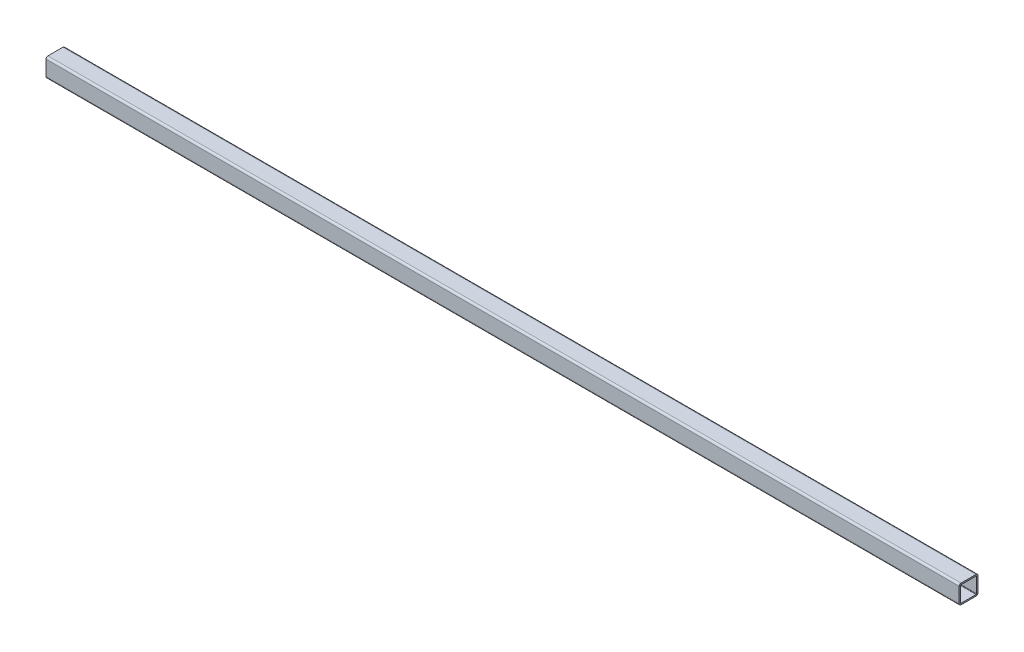
ISO-10303-21;
HEADER;
FILE_DESCRIPTION(('STEP AP214'),'2;1');
FILE_NAME('part.step','',(''),(''),'','','');
FILE_SCHEMA(('AUTOMOTIVE_DESIGN { 1 0 10303 214 1 1 1 1 }'));
ENDSEC;
DATA;
#1=APPLICATION_CONTEXT('core data for automotive mechanical design processes');
#2=APPLICATION_PROTOCOL_DEFINITION('international standard','automotive_design',2000,#1);
#3=PRODUCT_CONTEXT('',#1,'mechanical');
#4=PRODUCT('Part','Part','',(#3));
#5=PRODUCT_RELATED_PRODUCT_CATEGORY('part','',(#4));
#6=PRODUCT_DEFINITION_FORMATION('','',#4);
#7=PRODUCT_DEFINITION_CONTEXT('part definition',#1,'design');
#8=PRODUCT_DEFINITION('design','',#6,#7);
#9=PRODUCT_DEFINITION_SHAPE('','',#8);
#10=(LENGTH_UNIT() NAMED_UNIT(*) SI_UNIT(.MILLI.,.METRE.));
#11=(NAMED_UNIT(*) PLANE_ANGLE_UNIT() SI_UNIT($,.RADIAN.));
#12=(NAMED_UNIT(*) SI_UNIT($,.STERADIAN.) SOLID_ANGLE_UNIT());
#13=UNCERTAINTY_MEASURE_WITH_UNIT(LENGTH_MEASURE(1.E-05),#10,'distance_accuracy_value','');
#14=(GEOMETRIC_REPRESENTATION_CONTEXT(3) GLOBAL_UNCERTAINTY_ASSIGNED_CONTEXT((#13)) GLOBAL_UNIT_ASSIGNED_CONTEXT((#10,
#11,#12)) REPRESENTATION_CONTEXT('',''));
#15=CARTESIAN_POINT('',(0.,0.,0.));
#16=DIRECTION('',(0.,0.,1.));
#17=DIRECTION('',(1.,0.,0.));
#18=AXIS2_PLACEMENT_3D('',#15,#16,#17);
#19=CARTESIAN_POINT('',(484.5,8.,8.));
#20=DIRECTION('',(-1.,0.,0.));
#21=DIRECTION('',(0.,0.,1.));
#22=AXIS2_PLACEMENT_3D('',#19,#20,#21);
#23=CYLINDRICAL_SURFACE('',#22,2.);
#24=CARTESIAN_POINT('',(-484.5,8.,8.));
#25=DIRECTION('',(1.,0.,0.));
#26=DIRECTION('',(0.,0.,-1.));
#27=AXIS2_PLACEMENT_3D('',#24,#25,#26);
#28=CIRCLE('',#27,2.);
#29=CARTESIAN_POINT('',(-484.5,10.,8.));
#30=VERTEX_POINT('',#29);
#31=CARTESIAN_POINT('',(-484.5,8.,9.99999999999999));
#32=VERTEX_POINT('',#31);
#33=EDGE_CURVE('E235',#30,#32,#28,.T.);
#34=ORIENTED_EDGE('',*,*,#33,.T.);
#35=DIRECTION('',(-1.,0.,0.));
#36=VECTOR('',#35,1.);
#37=CARTESIAN_POINT('',(484.5,8.,9.99999999999999));
#38=LINE('',#37,#36);
#39=CARTESIAN_POINT('',(484.5,8.,9.99999999999999));
#40=VERTEX_POINT('',#39);
#41=EDGE_CURVE('E12',#40,#32,#38,.T.);
#42=ORIENTED_EDGE('',*,*,#41,.F.);
#43=CARTESIAN_POINT('',(484.5,8.,8.));
#44=DIRECTION('',(1.,0.,0.));
#45=DIRECTION('',(0.,0.,-1.));
#46=AXIS2_PLACEMENT_3D('',#43,#44,#45);
#47=CIRCLE('',#46,2.);
#48=CARTESIAN_POINT('',(484.5,10.,8.));
#49=VERTEX_POINT('',#48);
#50=EDGE_CURVE('E313',#49,#40,#47,.T.);
#51=ORIENTED_EDGE('',*,*,#50,.F.);
#52=DIRECTION('',(-1.,0.,0.));
#53=VECTOR('',#52,1.);
#54=CARTESIAN_POINT('',(484.5,10.,8.));
#55=LINE('',#54,#53);
#56=EDGE_CURVE('E250',#49,#30,#55,.T.);
#57=ORIENTED_EDGE('',*,*,#56,.T.);
#58=EDGE_LOOP('',(#34,#42,#51,#57));
#59=FACE_BOUND('',#58,.T.);
#60=ADVANCED_FACE('F63',(#59),#23,.T.);
#61=CARTESIAN_POINT('',(484.5,8.,9.99999999999999));
#62=DIRECTION('',(0.,0.,-1.));
#63=DIRECTION('',(-1.,0.,0.));
#64=AXIS2_PLACEMENT_3D('',#61,#62,#63);
#65=PLANE('',#64);
#66=DIRECTION('',(0.,-1.,0.));
#67=VECTOR('',#66,1.);
#68=CARTESIAN_POINT('',(-484.5,8.,9.99999999999999));
#69=LINE('',#68,#67);
#70=CARTESIAN_POINT('',(-484.5,-8.,10.));
#71=VERTEX_POINT('',#70);
#72=EDGE_CURVE('E238',#32,#71,#69,.T.);
#73=ORIENTED_EDGE('',*,*,#72,.T.);
#74=DIRECTION('',(-1.,0.,0.));
#75=VECTOR('',#74,1.);
#76=CARTESIAN_POINT('',(484.5,-8.,10.));
#77=LINE('',#76,#75);
#78=CARTESIAN_POINT('',(484.5,-8.,10.));
#79=VERTEX_POINT('',#78);
#80=EDGE_CURVE('E73',#79,#71,#77,.T.);
#81=ORIENTED_EDGE('',*,*,#80,.F.);
#82=DIRECTION('',(0.,-1.,0.));
#83=VECTOR('',#82,1.);
#84=CARTESIAN_POINT('',(484.5,8.,9.99999999999999));
#85=LINE('',#84,#83);
#86=EDGE_CURVE('E315',#40,#79,#85,.T.);
#87=ORIENTED_EDGE('',*,*,#86,.F.);
#88=ORIENTED_EDGE('',*,*,#41,.T.);
#89=EDGE_LOOP('',(#73,#81,#87,#88));
#90=FACE_BOUND('',#89,.T.);
#91=ADVANCED_FACE('F350',(#90),#65,.F.);
#92=CARTESIAN_POINT('',(484.5,-8.,8.));
#93=DIRECTION('',(-1.,0.,0.));
#94=DIRECTION('',(0.,0.,1.));
#95=AXIS2_PLACEMENT_3D('',#92,#93,#94);
#96=CYLINDRICAL_SURFACE('',#95,2.);
#97=CARTESIAN_POINT('',(-484.5,-8.,8.));
#98=DIRECTION('',(1.,0.,0.));
#99=DIRECTION('',(0.,0.,-1.));
#100=AXIS2_PLACEMENT_3D('',#97,#98,#99);
#101=CIRCLE('',#100,2.);
#102=CARTESIAN_POINT('',(-484.5,-10.,8.));
#103=VERTEX_POINT('',#102);
#104=EDGE_CURVE('E240',#71,#103,#101,.T.);
#105=ORIENTED_EDGE('',*,*,#104,.T.);
#106=DIRECTION('',(-1.,0.,0.));
#107=VECTOR('',#106,1.);
#108=CARTESIAN_POINT('',(484.5,-10.,8.));
#109=LINE('',#108,#107);
#110=CARTESIAN_POINT('',(484.5,-10.,8.));
#111=VERTEX_POINT('',#110);
#112=EDGE_CURVE('E257',#111,#103,#109,.T.);
#113=ORIENTED_EDGE('',*,*,#112,.F.);
#114=CARTESIAN_POINT('',(484.5,-8.,8.));
#115=DIRECTION('',(1.,0.,0.));
#116=DIRECTION('',(0.,0.,-1.));
#117=AXIS2_PLACEMENT_3D('',#114,#115,#116);
#118=CIRCLE('',#117,2.);
#119=EDGE_CURVE('E317',#79,#111,#118,.T.);
#120=ORIENTED_EDGE('',*,*,#119,.F.);
#121=ORIENTED_EDGE('',*,*,#80,.T.);
#122=EDGE_LOOP('',(#105,#113,#120,#121));
#123=FACE_BOUND('',#122,.T.);
#124=ADVANCED_FACE('F355',(#123),#96,.T.);
#125=CARTESIAN_POINT('',(484.5,-10.,-8.));
#126=DIRECTION('',(0.,1.,0.));
#127=DIRECTION('',(0.,0.,1.));
#128=AXIS2_PLACEMENT_3D('',#125,#126,#127);
#129=PLANE('',#128);
#130=DIRECTION('',(0.,0.,-1.));
#131=VECTOR('',#130,1.);
#132=CARTESIAN_POINT('',(-484.5,-10.,-8.));
#133=LINE('',#132,#131);
#134=CARTESIAN_POINT('',(-484.5,-10.,-8.));
#135=VERTEX_POINT('',#134);
#136=EDGE_CURVE('E242',#103,#135,#133,.T.);
#137=ORIENTED_EDGE('',*,*,#136,.T.);
#138=DIRECTION('',(-1.,0.,0.));
#139=VECTOR('',#138,1.);
#140=CARTESIAN_POINT('',(484.5,-10.,-8.));
#141=LINE('',#140,#139);
#142=CARTESIAN_POINT('',(484.5,-10.,-8.));
#143=VERTEX_POINT('',#142);
#144=EDGE_CURVE('E254',#143,#135,#141,.T.);
#145=ORIENTED_EDGE('',*,*,#144,.F.);
#146=DIRECTION('',(0.,0.,-1.));
#147=VECTOR('',#146,1.);
#148=CARTESIAN_POINT('',(484.5,-10.,-8.));
#149=LINE('',#148,#147);
#150=EDGE_CURVE('E319',#111,#143,#149,.T.);
#151=ORIENTED_EDGE('',*,*,#150,.F.);
#152=ORIENTED_EDGE('',*,*,#112,.T.);
#153=EDGE_LOOP('',(#137,#145,#151,#152));
#154=FACE_BOUND('',#153,.T.);
#155=ADVANCED_FACE('F325',(#154),#129,.F.);
#156=CARTESIAN_POINT('',(484.5,-8.,-8.));
#157=DIRECTION('',(-1.,0.,0.));
#158=DIRECTION('',(0.,0.,1.));
#159=AXIS2_PLACEMENT_3D('',#156,#157,#158);
#160=CYLINDRICAL_SURFACE('',#159,2.);
#161=CARTESIAN_POINT('',(-484.5,-8.,-8.));
#162=DIRECTION('',(1.,0.,0.));
#163=DIRECTION('',(0.,0.,-1.));
#164=AXIS2_PLACEMENT_3D('',#161,#162,#163);
#165=CIRCLE('',#164,2.);
#166=CARTESIAN_POINT('',(-484.5,-8.,-9.99999999999999));
#167=VERTEX_POINT('',#166);
#168=EDGE_CURVE('E244',#135,#167,#165,.T.);
#169=ORIENTED_EDGE('',*,*,#168,.T.);
#170=DIRECTION('',(-1.,0.,0.));
#171=VECTOR('',#170,1.);
#172=CARTESIAN_POINT('',(484.5,-8.,-9.99999999999999));
#173=LINE('',#172,#171);
#174=CARTESIAN_POINT('',(484.5,-8.,-9.99999999999999));
#175=VERTEX_POINT('',#174);
#176=EDGE_CURVE('E202',#175,#167,#173,.T.);
#177=ORIENTED_EDGE('',*,*,#176,.F.);
#178=CARTESIAN_POINT('',(484.5,-8.,-8.));
#179=DIRECTION('',(1.,0.,0.));
#180=DIRECTION('',(0.,0.,-1.));
#181=AXIS2_PLACEMENT_3D('',#178,#179,#180);
#182=CIRCLE('',#181,2.);
#183=EDGE_CURVE('E193',#143,#175,#182,.T.);
#184=ORIENTED_EDGE('',*,*,#183,.F.);
#185=ORIENTED_EDGE('',*,*,#144,.T.);
#186=EDGE_LOOP('',(#169,#177,#184,#185));
#187=FACE_BOUND('',#186,.T.);
#188=ADVANCED_FACE('F329',(#187),#160,.T.);
#189=CARTESIAN_POINT('',(484.5,-8.,-9.99999999999999));
#190=DIRECTION('',(0.,0.,1.));
#191=DIRECTION('',(1.,0.,0.));
#192=AXIS2_PLACEMENT_3D('',#189,#190,#191);
#193=PLANE('',#192);
#194=DIRECTION('',(0.,1.,0.));
#195=VECTOR('',#194,1.);
#196=CARTESIAN_POINT('',(-484.5,-8.,-9.99999999999999));
#197=LINE('',#196,#195);
#198=CARTESIAN_POINT('',(-484.5,8.,-10.));
#199=VERTEX_POINT('',#198);
#200=EDGE_CURVE('E201',#167,#199,#197,.T.);
#201=ORIENTED_EDGE('',*,*,#200,.T.);
#202=DIRECTION('',(-1.,0.,0.));
#203=VECTOR('',#202,1.);
#204=CARTESIAN_POINT('',(484.5,8.,-10.));
#205=LINE('',#204,#203);
#206=CARTESIAN_POINT('',(484.5,8.,-10.));
#207=VERTEX_POINT('',#206);
#208=EDGE_CURVE('E198',#207,#199,#205,.T.);
#209=ORIENTED_EDGE('',*,*,#208,.F.);
#210=DIRECTION('',(0.,1.,0.));
#211=VECTOR('',#210,1.);
#212=CARTESIAN_POINT('',(484.5,-8.,-9.99999999999999));
#213=LINE('',#212,#211);
#214=EDGE_CURVE('E187',#175,#207,#213,.T.);
#215=ORIENTED_EDGE('',*,*,#214,.F.);
#216=ORIENTED_EDGE('',*,*,#176,.T.);
#217=EDGE_LOOP('',(#201,#209,#215,#216));
#218=FACE_BOUND('',#217,.T.);
#219=ADVANCED_FACE('F199',(#218),#193,.F.);
#220=CARTESIAN_POINT('',(484.5,8.,-8.));
#221=DIRECTION('',(-1.,0.,0.));
#222=DIRECTION('',(0.,0.,1.));
#223=AXIS2_PLACEMENT_3D('',#220,#221,#222);
#224=CYLINDRICAL_SURFACE('',#223,2.);
#225=CARTESIAN_POINT('',(-484.5,8.,-8.));
#226=DIRECTION('',(1.,0.,0.));
#227=DIRECTION('',(0.,0.,-1.));
#228=AXIS2_PLACEMENT_3D('',#225,#226,#227);
#229=CIRCLE('',#228,2.);
#230=CARTESIAN_POINT('',(-484.5,10.,-8.));
#231=VERTEX_POINT('',#230);
#232=EDGE_CURVE('E135',#199,#231,#229,.T.);
#233=ORIENTED_EDGE('',*,*,#232,.T.);
#234=DIRECTION('',(-1.,0.,0.));
#235=VECTOR('',#234,1.);
#236=CARTESIAN_POINT('',(484.5,10.,-8.));
#237=LINE('',#236,#235);
#238=CARTESIAN_POINT('',(484.5,10.,-8.));
#239=VERTEX_POINT('',#238);
#240=EDGE_CURVE('E203',#239,#231,#237,.T.);
#241=ORIENTED_EDGE('',*,*,#240,.F.);
#242=CARTESIAN_POINT('',(484.5,8.,-8.));
#243=DIRECTION('',(1.,0.,0.));
#244=DIRECTION('',(0.,0.,-1.));
#245=AXIS2_PLACEMENT_3D('',#242,#243,#244);
#246=CIRCLE('',#245,2.);
#247=EDGE_CURVE('E191',#207,#239,#246,.T.);
#248=ORIENTED_EDGE('',*,*,#247,.F.);
#249=ORIENTED_EDGE('',*,*,#208,.T.);
#250=EDGE_LOOP('',(#233,#241,#248,#249));
#251=FACE_BOUND('',#250,.T.);
#252=ADVANCED_FACE('F205',(#251),#224,.T.);
#253=CARTESIAN_POINT('',(484.5,-8.,8.));
#254=DIRECTION('',(-1.,0.,0.));
#255=DIRECTION('',(0.,0.,1.));
#256=AXIS2_PLACEMENT_3D('',#253,#254,#255);
#257=CYLINDRICAL_SURFACE('',#256,0.500000000000002);
#258=CARTESIAN_POINT('',(-484.5,-8.,8.));
#259=DIRECTION('',(1.,0.,0.));
#260=DIRECTION('',(0.,0.,-1.));
#261=AXIS2_PLACEMENT_3D('',#258,#259,#260);
#262=CIRCLE('',#261,0.500000000000002);
#263=CARTESIAN_POINT('',(-484.5,-8.,8.5));
#264=VERTEX_POINT('',#263);
#265=CARTESIAN_POINT('',(-484.5,-8.5,8.));
#266=VERTEX_POINT('',#265);
#267=EDGE_CURVE('E211',#264,#266,#262,.T.);
#268=ORIENTED_EDGE('',*,*,#267,.F.);
#269=DIRECTION('',(-1.,0.,0.));
#270=VECTOR('',#269,1.);
#271=CARTESIAN_POINT('',(484.5,-8.,8.5));
#272=LINE('',#271,#270);
#273=CARTESIAN_POINT('',(484.5,-8.,8.5));
#274=VERTEX_POINT('',#273);
#275=EDGE_CURVE('E67',#274,#264,#272,.T.);
#276=ORIENTED_EDGE('',*,*,#275,.F.);
#277=CARTESIAN_POINT('',(484.5,-8.,8.));
#278=DIRECTION('',(1.,0.,0.));
#279=DIRECTION('',(0.,0.,-1.));
#280=AXIS2_PLACEMENT_3D('',#277,#278,#279);
#281=CIRCLE('',#280,0.500000000000002);
#282=CARTESIAN_POINT('',(484.5,-8.5,8.));
#283=VERTEX_POINT('',#282);
#284=EDGE_CURVE('E249',#274,#283,#281,.T.);
#285=ORIENTED_EDGE('',*,*,#284,.T.);
#286=DIRECTION('',(-1.,0.,0.));
#287=VECTOR('',#286,1.);
#288=CARTESIAN_POINT('',(484.5,-8.5,8.));
#289=LINE('',#288,#287);
#290=EDGE_CURVE('E207',#283,#266,#289,.T.);
#291=ORIENTED_EDGE('',*,*,#290,.T.);
#292=EDGE_LOOP('',(#268,#276,#285,#291));
#293=FACE_BOUND('',#292,.T.);
#294=ADVANCED_FACE('F65',(#293),#257,.F.);
#295=CARTESIAN_POINT('',(484.5,8.,8.5));
#296=DIRECTION('',(0.,0.,-1.));
#297=DIRECTION('',(-1.,0.,0.));
#298=AXIS2_PLACEMENT_3D('',#295,#296,#297);
#299=PLANE('',#298);
#300=DIRECTION('',(0.,-1.,0.));
#301=VECTOR('',#300,1.);
#302=CARTESIAN_POINT('',(-484.5,8.,8.5));
#303=LINE('',#302,#301);
#304=CARTESIAN_POINT('',(-484.5,8.,8.5));
#305=VERTEX_POINT('',#304);
#306=EDGE_CURVE('E214',#305,#264,#303,.T.);
#307=ORIENTED_EDGE('',*,*,#306,.F.);
#308=DIRECTION('',(-1.,0.,0.));
#309=VECTOR('',#308,1.);
#310=CARTESIAN_POINT('',(484.5,8.,8.5));
#311=LINE('',#310,#309);
#312=CARTESIAN_POINT('',(484.5,8.,8.5));
#313=VERTEX_POINT('',#312);
#314=EDGE_CURVE('E272',#313,#305,#311,.T.);
#315=ORIENTED_EDGE('',*,*,#314,.F.);
#316=DIRECTION('',(0.,-1.,0.));
#317=VECTOR('',#316,1.);
#318=CARTESIAN_POINT('',(484.5,8.,8.5));
#319=LINE('',#318,#317);
#320=EDGE_CURVE('E281',#313,#274,#319,.T.);
#321=ORIENTED_EDGE('',*,*,#320,.T.);
#322=ORIENTED_EDGE('',*,*,#275,.T.);
#323=EDGE_LOOP('',(#307,#315,#321,#322));
#324=FACE_BOUND('',#323,.T.);
#325=ADVANCED_FACE('F279',(#324),#299,.T.);
#326=CARTESIAN_POINT('',(484.5,8.,8.));
#327=DIRECTION('',(-1.,0.,0.));
#328=DIRECTION('',(0.,0.,1.));
#329=AXIS2_PLACEMENT_3D('',#326,#327,#328);
#330=CYLINDRICAL_SURFACE('',#329,0.500000000000002);
#331=CARTESIAN_POINT('',(-484.5,8.,8.));
#332=DIRECTION('',(1.,0.,0.));
#333=DIRECTION('',(0.,0.,-1.));
#334=AXIS2_PLACEMENT_3D('',#331,#332,#333);
#335=CIRCLE('',#334,0.500000000000002);
#336=CARTESIAN_POINT('',(-484.5,8.5,8.));
#337=VERTEX_POINT('',#336);
#338=EDGE_CURVE('E217',#337,#305,#335,.T.);
#339=ORIENTED_EDGE('',*,*,#338,.F.);
#340=DIRECTION('',(-1.,0.,0.));
#341=VECTOR('',#340,1.);
#342=CARTESIAN_POINT('',(484.5,8.5,8.));
#343=LINE('',#342,#341);
#344=CARTESIAN_POINT('',(484.5,8.5,8.));
#345=VERTEX_POINT('',#344);
#346=EDGE_CURVE('E271',#345,#337,#343,.T.);
#347=ORIENTED_EDGE('',*,*,#346,.F.);
#348=CARTESIAN_POINT('',(484.5,8.,8.));
#349=DIRECTION('',(1.,0.,0.));
#350=DIRECTION('',(0.,0.,-1.));
#351=AXIS2_PLACEMENT_3D('',#348,#349,#350);
#352=CIRCLE('',#351,0.500000000000002);
#353=EDGE_CURVE('E289',#345,#313,#352,.T.);
#354=ORIENTED_EDGE('',*,*,#353,.T.);
#355=ORIENTED_EDGE('',*,*,#314,.T.);
#356=EDGE_LOOP('',(#339,#347,#354,#355));
#357=FACE_BOUND('',#356,.T.);
#358=ADVANCED_FACE('F287',(#357),#330,.F.);
#359=CARTESIAN_POINT('',(484.5,8.5,8.));
#360=DIRECTION('',(0.,-1.,0.));
#361=DIRECTION('',(0.,0.,-1.));
#362=AXIS2_PLACEMENT_3D('',#359,#360,#361);
#363=PLANE('',#362);
#364=DIRECTION('',(0.,0.,1.));
#365=VECTOR('',#364,1.);
#366=CARTESIAN_POINT('',(-484.5,8.5,8.));
#367=LINE('',#366,#365);
#368=CARTESIAN_POINT('',(-484.5,8.5,-8.));
#369=VERTEX_POINT('',#368);
#370=EDGE_CURVE('E220',#369,#337,#367,.T.);
#371=ORIENTED_EDGE('',*,*,#370,.F.);
#372=DIRECTION('',(-1.,0.,0.));
#373=VECTOR('',#372,1.);
#374=CARTESIAN_POINT('',(484.5,8.5,-8.));
#375=LINE('',#374,#373);
#376=CARTESIAN_POINT('',(484.5,8.5,-8.));
#377=VERTEX_POINT('',#376);
#378=EDGE_CURVE('E269',#377,#369,#375,.T.);
#379=ORIENTED_EDGE('',*,*,#378,.F.);
#380=DIRECTION('',(0.,0.,1.));
#381=VECTOR('',#380,1.);
#382=CARTESIAN_POINT('',(484.5,8.5,8.));
#383=LINE('',#382,#381);
#384=EDGE_CURVE('E295',#377,#345,#383,.T.);
#385=ORIENTED_EDGE('',*,*,#384,.T.);
#386=ORIENTED_EDGE('',*,*,#346,.T.);
#387=EDGE_LOOP('',(#371,#379,#385,#386));
#388=FACE_BOUND('',#387,.T.);
#389=ADVANCED_FACE('F298',(#388),#363,.T.);
#390=CARTESIAN_POINT('',(484.5,8.,-8.));
#391=DIRECTION('',(-1.,0.,0.));
#392=DIRECTION('',(0.,0.,1.));
#393=AXIS2_PLACEMENT_3D('',#390,#391,#392);
#394=CYLINDRICAL_SURFACE('',#393,0.500000000000002);
#395=CARTESIAN_POINT('',(-484.5,8.,-8.));
#396=DIRECTION('',(1.,0.,0.));
#397=DIRECTION('',(0.,0.,-1.));
#398=AXIS2_PLACEMENT_3D('',#395,#396,#397);
#399=CIRCLE('',#398,0.500000000000002);
#400=CARTESIAN_POINT('',(-484.5,8.,-8.5));
#401=VERTEX_POINT('',#400);
#402=EDGE_CURVE('E223',#401,#369,#399,.T.);
#403=ORIENTED_EDGE('',*,*,#402,.F.);
#404=DIRECTION('',(-1.,0.,0.));
#405=VECTOR('',#404,1.);
#406=CARTESIAN_POINT('',(484.5,8.,-8.5));
#407=LINE('',#406,#405);
#408=CARTESIAN_POINT('',(484.5,8.,-8.5));
#409=VERTEX_POINT('',#408);
#410=EDGE_CURVE('E267',#409,#401,#407,.T.);
#411=ORIENTED_EDGE('',*,*,#410,.F.);
#412=CARTESIAN_POINT('',(484.5,8.,-8.));
#413=DIRECTION('',(1.,0.,0.));
#414=DIRECTION('',(0.,0.,-1.));
#415=AXIS2_PLACEMENT_3D('',#412,#413,#414);
#416=CIRCLE('',#415,0.500000000000002);
#417=EDGE_CURVE('E299',#409,#377,#416,.T.);
#418=ORIENTED_EDGE('',*,*,#417,.T.);
#419=ORIENTED_EDGE('',*,*,#378,.T.);
#420=EDGE_LOOP('',(#403,#411,#418,#419));
#421=FACE_BOUND('',#420,.T.);
#422=ADVANCED_FACE('F366',(#421),#394,.F.);
#423=CARTESIAN_POINT('',(484.5,-8.,-8.5));
#424=DIRECTION('',(0.,0.,1.));
#425=DIRECTION('',(1.,0.,0.));
#426=AXIS2_PLACEMENT_3D('',#423,#424,#425);
#427=PLANE('',#426);
#428=DIRECTION('',(0.,1.,0.));
#429=VECTOR('',#428,1.);
#430=CARTESIAN_POINT('',(-484.5,-8.,-8.5));
#431=LINE('',#430,#429);
#432=CARTESIAN_POINT('',(-484.5,-8.,-8.5));
#433=VERTEX_POINT('',#432);
#434=EDGE_CURVE('E226',#433,#401,#431,.T.);
#435=ORIENTED_EDGE('',*,*,#434,.F.);
#436=DIRECTION('',(-1.,0.,0.));
#437=VECTOR('',#436,1.);
#438=CARTESIAN_POINT('',(484.5,-8.,-8.5));
#439=LINE('',#438,#437);
#440=CARTESIAN_POINT('',(484.5,-8.,-8.5));
#441=VERTEX_POINT('',#440);
#442=EDGE_CURVE('E265',#441,#433,#439,.T.);
#443=ORIENTED_EDGE('',*,*,#442,.F.);
#444=DIRECTION('',(0.,1.,0.));
#445=VECTOR('',#444,1.);
#446=CARTESIAN_POINT('',(484.5,-8.,-8.5));
#447=LINE('',#446,#445);
#448=EDGE_CURVE('E301',#441,#409,#447,.T.);
#449=ORIENTED_EDGE('',*,*,#448,.T.);
#450=ORIENTED_EDGE('',*,*,#410,.T.);
#451=EDGE_LOOP('',(#435,#443,#449,#450));
#452=FACE_BOUND('',#451,.T.);
#453=ADVANCED_FACE('F362',(#452),#427,.T.);
#454=CARTESIAN_POINT('',(484.5,-8.,-8.));
#455=DIRECTION('',(-1.,0.,0.));
#456=DIRECTION('',(0.,0.,1.));
#457=AXIS2_PLACEMENT_3D('',#454,#455,#456);
#458=CYLINDRICAL_SURFACE('',#457,0.500000000000002);
#459=CARTESIAN_POINT('',(-484.5,-8.,-8.));
#460=DIRECTION('',(1.,0.,0.));
#461=DIRECTION('',(0.,0.,-1.));
#462=AXIS2_PLACEMENT_3D('',#459,#460,#461);
#463=CIRCLE('',#462,0.500000000000002);
#464=CARTESIAN_POINT('',(-484.5,-8.5,-8.));
#465=VERTEX_POINT('',#464);
#466=EDGE_CURVE('E229',#465,#433,#463,.T.);
#467=ORIENTED_EDGE('',*,*,#466,.F.);
#468=DIRECTION('',(-1.,0.,0.));
#469=VECTOR('',#468,1.);
#470=CARTESIAN_POINT('',(484.5,-8.5,-8.));
#471=LINE('',#470,#469);
#472=CARTESIAN_POINT('',(484.5,-8.5,-8.));
#473=VERTEX_POINT('',#472);
#474=EDGE_CURVE('E263',#473,#465,#471,.T.);
#475=ORIENTED_EDGE('',*,*,#474,.F.);
#476=CARTESIAN_POINT('',(484.5,-8.,-8.));
#477=DIRECTION('',(1.,0.,0.));
#478=DIRECTION('',(0.,0.,-1.));
#479=AXIS2_PLACEMENT_3D('',#476,#477,#478);
#480=CIRCLE('',#479,0.500000000000002);
#481=EDGE_CURVE('E307',#473,#441,#480,.T.);
#482=ORIENTED_EDGE('',*,*,#481,.T.);
#483=ORIENTED_EDGE('',*,*,#442,.T.);
#484=EDGE_LOOP('',(#467,#475,#482,#483));
#485=FACE_BOUND('',#484,.T.);
#486=ADVANCED_FACE('F344',(#485),#458,.F.);
#487=CARTESIAN_POINT('',(484.5,-8.5,-8.));
#488=DIRECTION('',(0.,1.,0.));
#489=DIRECTION('',(0.,0.,1.));
#490=AXIS2_PLACEMENT_3D('',#487,#488,#489);
#491=PLANE('',#490);
#492=DIRECTION('',(0.,0.,-1.));
#493=VECTOR('',#492,1.);
#494=CARTESIAN_POINT('',(-484.5,-8.5,-8.));
#495=LINE('',#494,#493);
#496=EDGE_CURVE('E232',#266,#465,#495,.T.);
#497=ORIENTED_EDGE('',*,*,#496,.F.);
#498=ORIENTED_EDGE('',*,*,#290,.F.);
#499=DIRECTION('',(0.,0.,-1.));
#500=VECTOR('',#499,1.);
#501=CARTESIAN_POINT('',(484.5,-8.5,-8.));
#502=LINE('',#501,#500);
#503=EDGE_CURVE('E310',#283,#473,#502,.T.);
#504=ORIENTED_EDGE('',*,*,#503,.T.);
#505=ORIENTED_EDGE('',*,*,#474,.T.);
#506=EDGE_LOOP('',(#497,#498,#504,#505));
#507=FACE_BOUND('',#506,.T.);
#508=ADVANCED_FACE('F337',(#507),#491,.T.);
#509=CARTESIAN_POINT('',(484.5,10.,8.));
#510=DIRECTION('',(0.,-1.,0.));
#511=DIRECTION('',(0.,0.,-1.));
#512=AXIS2_PLACEMENT_3D('',#509,#510,#511);
#513=PLANE('',#512);
#514=DIRECTION('',(0.,0.,1.));
#515=VECTOR('',#514,1.);
#516=CARTESIAN_POINT('',(-484.5,10.,8.));
#517=LINE('',#516,#515);
#518=EDGE_CURVE('E141',#231,#30,#517,.T.);
#519=ORIENTED_EDGE('',*,*,#518,.T.);
#520=ORIENTED_EDGE('',*,*,#56,.F.);
#521=DIRECTION('',(0.,0.,1.));
#522=VECTOR('',#521,1.);
#523=CARTESIAN_POINT('',(484.5,10.,8.));
#524=LINE('',#523,#522);
#525=EDGE_CURVE('E82',#239,#49,#524,.T.);
#526=ORIENTED_EDGE('',*,*,#525,.F.);
#527=ORIENTED_EDGE('',*,*,#240,.T.);
#528=EDGE_LOOP('',(#519,#520,#526,#527));
#529=FACE_BOUND('',#528,.T.);
#530=ADVANCED_FACE('F335',(#529),#513,.F.);
#531=CARTESIAN_POINT('',(484.5,8.,8.));
#532=DIRECTION('',(1.,0.,0.));
#533=DIRECTION('',(0.,0.,-1.));
#534=AXIS2_PLACEMENT_3D('',#531,#532,#533);
#535=PLANE('',#534);
#536=ORIENTED_EDGE('',*,*,#284,.F.);
#537=ORIENTED_EDGE('',*,*,#320,.F.);
#538=ORIENTED_EDGE('',*,*,#353,.F.);
#539=ORIENTED_EDGE('',*,*,#384,.F.);
#540=ORIENTED_EDGE('',*,*,#417,.F.);
#541=ORIENTED_EDGE('',*,*,#448,.F.);
#542=ORIENTED_EDGE('',*,*,#481,.F.);
#543=ORIENTED_EDGE('',*,*,#503,.F.);
#544=EDGE_LOOP('',(#536,#537,#538,#539,#540,#541,#542,#543));
#545=FACE_BOUND('',#544,.T.);
#546=ORIENTED_EDGE('',*,*,#50,.T.);
#547=ORIENTED_EDGE('',*,*,#86,.T.);
#548=ORIENTED_EDGE('',*,*,#119,.T.);
#549=ORIENTED_EDGE('',*,*,#150,.T.);
#550=ORIENTED_EDGE('',*,*,#183,.T.);
#551=ORIENTED_EDGE('',*,*,#214,.T.);
#552=ORIENTED_EDGE('',*,*,#247,.T.);
#553=ORIENTED_EDGE('',*,*,#525,.T.);
#554=EDGE_LOOP('',(#546,#547,#548,#549,#550,#551,#552,#553));
#555=FACE_BOUND('',#554,.T.);
#556=ADVANCED_FACE('F189',(#545,#555),#535,.T.);
#557=CARTESIAN_POINT('',(-484.5,8.,8.));
#558=DIRECTION('',(1.,0.,0.));
#559=DIRECTION('',(0.,0.,-1.));
#560=AXIS2_PLACEMENT_3D('',#557,#558,#559);
#561=PLANE('',#560);
#562=ORIENTED_EDGE('',*,*,#267,.T.);
#563=ORIENTED_EDGE('',*,*,#496,.T.);
#564=ORIENTED_EDGE('',*,*,#466,.T.);
#565=ORIENTED_EDGE('',*,*,#434,.T.);
#566=ORIENTED_EDGE('',*,*,#402,.T.);
#567=ORIENTED_EDGE('',*,*,#370,.T.);
#568=ORIENTED_EDGE('',*,*,#338,.T.);
#569=ORIENTED_EDGE('',*,*,#306,.T.);
#570=EDGE_LOOP('',(#562,#563,#564,#565,#566,#567,#568,#569));
#571=FACE_BOUND('',#570,.T.);
#572=ORIENTED_EDGE('',*,*,#33,.F.);
#573=ORIENTED_EDGE('',*,*,#518,.F.);
#574=ORIENTED_EDGE('',*,*,#232,.F.);
#575=ORIENTED_EDGE('',*,*,#200,.F.);
#576=ORIENTED_EDGE('',*,*,#168,.F.);
#577=ORIENTED_EDGE('',*,*,#136,.F.);
#578=ORIENTED_EDGE('',*,*,#104,.F.);
#579=ORIENTED_EDGE('',*,*,#72,.F.);
#580=EDGE_LOOP('',(#572,#573,#574,#575,#576,#577,#578,#579));
#581=FACE_BOUND('',#580,.T.);
#582=ADVANCED_FACE('F284',(#571,#581),#561,.F.);
#583=CLOSED_SHELL('',(#60,#91,#124,#155,#188,#219,#252,#294,#325,#358,#389,#422,#453,#486,#508,
#530,#556,#582));
#584=MANIFOLD_SOLID_BREP('B2',#583);
#585=ADVANCED_BREP_SHAPE_REPRESENTATION('',(#18,#584),#14);
#586=SHAPE_DEFINITION_REPRESENTATION(#9,#585);
ENDSEC;
END-ISO-10303-21;
